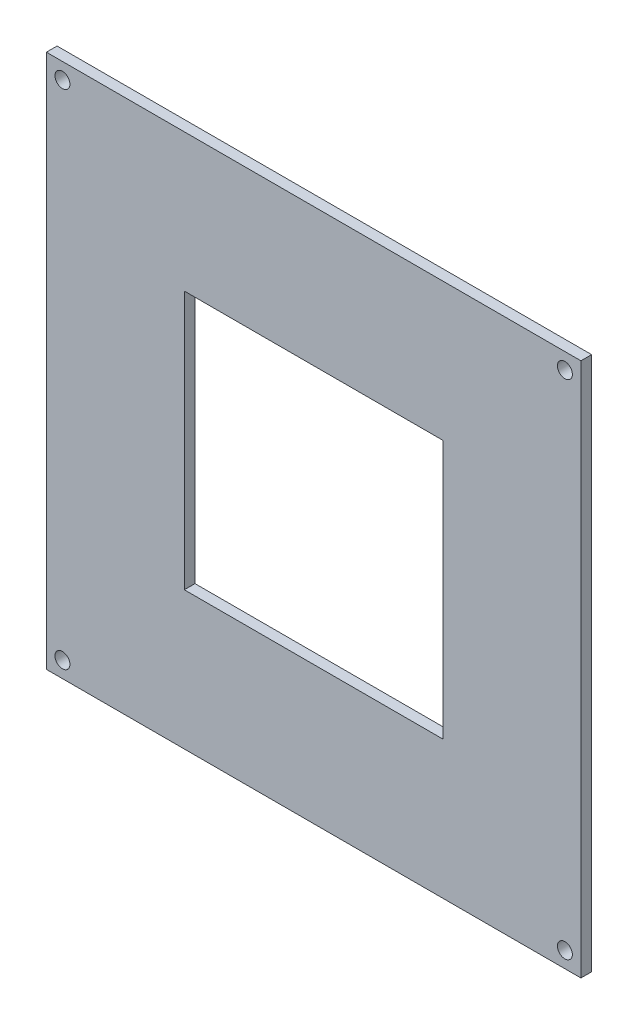
ISO-10303-21;
HEADER;
FILE_DESCRIPTION(('STEP AP214'),'2;1');
FILE_NAME('part.step','',(''),(''),'','','');
FILE_SCHEMA(('AUTOMOTIVE_DESIGN { 1 0 10303 214 1 1 1 1 }'));
ENDSEC;
DATA;
#1=APPLICATION_CONTEXT('core data for automotive mechanical design processes');
#2=APPLICATION_PROTOCOL_DEFINITION('international standard','automotive_design',2000,#1);
#3=PRODUCT_CONTEXT('',#1,'mechanical');
#4=PRODUCT('Part','Part','',(#3));
#5=PRODUCT_RELATED_PRODUCT_CATEGORY('part','',(#4));
#6=PRODUCT_DEFINITION_FORMATION('','',#4);
#7=PRODUCT_DEFINITION_CONTEXT('part definition',#1,'design');
#8=PRODUCT_DEFINITION('design','',#6,#7);
#9=PRODUCT_DEFINITION_SHAPE('','',#8);
#10=(LENGTH_UNIT() NAMED_UNIT(*) SI_UNIT(.MILLI.,.METRE.));
#11=(NAMED_UNIT(*) PLANE_ANGLE_UNIT() SI_UNIT($,.RADIAN.));
#12=(NAMED_UNIT(*) SI_UNIT($,.STERADIAN.) SOLID_ANGLE_UNIT());
#13=UNCERTAINTY_MEASURE_WITH_UNIT(LENGTH_MEASURE(1.E-05),#10,'distance_accuracy_value','');
#14=(GEOMETRIC_REPRESENTATION_CONTEXT(3) GLOBAL_UNCERTAINTY_ASSIGNED_CONTEXT((#13)) GLOBAL_UNIT_ASSIGNED_CONTEXT((#10,
#11,#12)) REPRESENTATION_CONTEXT('',''));
#15=CARTESIAN_POINT('',(0.,0.,0.));
#16=DIRECTION('',(0.,0.,1.));
#17=DIRECTION('',(1.,0.,0.));
#18=AXIS2_PLACEMENT_3D('',#15,#16,#17);
#19=CARTESIAN_POINT('',(-125.,125.,5.));
#20=DIRECTION('',(1.,0.,0.));
#21=DIRECTION('',(0.,1.,0.));
#22=AXIS2_PLACEMENT_3D('',#19,#20,#21);
#23=PLANE('',#22);
#24=DIRECTION('',(0.,-1.,0.));
#25=VECTOR('',#24,1.);
#26=CARTESIAN_POINT('',(-125.,125.,0.));
#27=LINE('',#26,#25);
#28=CARTESIAN_POINT('',(-125.,125.,0.));
#29=VERTEX_POINT('',#28);
#30=CARTESIAN_POINT('',(-125.,-125.,0.));
#31=VERTEX_POINT('',#30);
#32=EDGE_CURVE('E180',#29,#31,#27,.T.);
#33=ORIENTED_EDGE('',*,*,#32,.T.);
#34=DIRECTION('',(0.,0.,-1.));
#35=VECTOR('',#34,1.);
#36=CARTESIAN_POINT('',(-125.,-125.,5.));
#37=LINE('',#36,#35);
#38=CARTESIAN_POINT('',(-125.,-125.,5.));
#39=VERTEX_POINT('',#38);
#40=EDGE_CURVE('E11',#39,#31,#37,.T.);
#41=ORIENTED_EDGE('',*,*,#40,.F.);
#42=DIRECTION('',(0.,-1.,0.));
#43=VECTOR('',#42,1.);
#44=CARTESIAN_POINT('',(-125.,125.,5.));
#45=LINE('',#44,#43);
#46=CARTESIAN_POINT('',(-125.,125.,5.));
#47=VERTEX_POINT('',#46);
#48=EDGE_CURVE('E184',#47,#39,#45,.T.);
#49=ORIENTED_EDGE('',*,*,#48,.F.);
#50=DIRECTION('',(0.,0.,-1.));
#51=VECTOR('',#50,1.);
#52=CARTESIAN_POINT('',(-125.,125.,5.));
#53=LINE('',#52,#51);
#54=EDGE_CURVE('E198',#47,#29,#53,.T.);
#55=ORIENTED_EDGE('',*,*,#54,.T.);
#56=EDGE_LOOP('',(#33,#41,#49,#55));
#57=FACE_BOUND('',#56,.T.);
#58=ADVANCED_FACE('F38',(#57),#23,.F.);
#59=CARTESIAN_POINT('',(-125.,-125.,5.));
#60=DIRECTION('',(0.,1.,0.));
#61=DIRECTION('',(0.,0.,1.));
#62=AXIS2_PLACEMENT_3D('',#59,#60,#61);
#63=PLANE('',#62);
#64=DIRECTION('',(1.,0.,0.));
#65=VECTOR('',#64,1.);
#66=CARTESIAN_POINT('',(-125.,-125.,0.));
#67=LINE('',#66,#65);
#68=CARTESIAN_POINT('',(125.,-125.,0.));
#69=VERTEX_POINT('',#68);
#70=EDGE_CURVE('E202',#31,#69,#67,.T.);
#71=ORIENTED_EDGE('',*,*,#70,.T.);
#72=DIRECTION('',(0.,0.,-1.));
#73=VECTOR('',#72,1.);
#74=CARTESIAN_POINT('',(125.,-125.,5.));
#75=LINE('',#74,#73);
#76=CARTESIAN_POINT('',(125.,-125.,5.));
#77=VERTEX_POINT('',#76);
#78=EDGE_CURVE('E46',#77,#69,#75,.T.);
#79=ORIENTED_EDGE('',*,*,#78,.F.);
#80=DIRECTION('',(1.,0.,0.));
#81=VECTOR('',#80,1.);
#82=CARTESIAN_POINT('',(-125.,-125.,5.));
#83=LINE('',#82,#81);
#84=EDGE_CURVE('E188',#39,#77,#83,.T.);
#85=ORIENTED_EDGE('',*,*,#84,.F.);
#86=ORIENTED_EDGE('',*,*,#40,.T.);
#87=EDGE_LOOP('',(#71,#79,#85,#86));
#88=FACE_BOUND('',#87,.T.);
#89=ADVANCED_FACE('F237',(#88),#63,.F.);
#90=CARTESIAN_POINT('',(125.,125.,5.));
#91=DIRECTION('',(-1.,0.,0.));
#92=DIRECTION('',(0.,-1.,0.));
#93=AXIS2_PLACEMENT_3D('',#90,#91,#92);
#94=PLANE('',#93);
#95=DIRECTION('',(0.,1.,0.));
#96=VECTOR('',#95,1.);
#97=CARTESIAN_POINT('',(125.,125.,0.));
#98=LINE('',#97,#96);
#99=CARTESIAN_POINT('',(125.,125.,0.));
#100=VERTEX_POINT('',#99);
#101=EDGE_CURVE('E205',#69,#100,#98,.T.);
#102=ORIENTED_EDGE('',*,*,#101,.T.);
#103=DIRECTION('',(0.,0.,-1.));
#104=VECTOR('',#103,1.);
#105=CARTESIAN_POINT('',(125.,125.,5.));
#106=LINE('',#105,#104);
#107=CARTESIAN_POINT('',(125.,125.,5.));
#108=VERTEX_POINT('',#107);
#109=EDGE_CURVE('E213',#108,#100,#106,.T.);
#110=ORIENTED_EDGE('',*,*,#109,.F.);
#111=DIRECTION('',(0.,1.,0.));
#112=VECTOR('',#111,1.);
#113=CARTESIAN_POINT('',(125.,125.,5.));
#114=LINE('',#113,#112);
#115=EDGE_CURVE('E192',#77,#108,#114,.T.);
#116=ORIENTED_EDGE('',*,*,#115,.F.);
#117=ORIENTED_EDGE('',*,*,#78,.T.);
#118=EDGE_LOOP('',(#102,#110,#116,#117));
#119=FACE_BOUND('',#118,.T.);
#120=ADVANCED_FACE('F222',(#119),#94,.F.);
#121=CARTESIAN_POINT('',(-125.,125.,5.));
#122=DIRECTION('',(0.,-1.,0.));
#123=DIRECTION('',(0.,0.,-1.));
#124=AXIS2_PLACEMENT_3D('',#121,#122,#123);
#125=PLANE('',#124);
#126=DIRECTION('',(-1.,0.,0.));
#127=VECTOR('',#126,1.);
#128=CARTESIAN_POINT('',(-125.,125.,0.));
#129=LINE('',#128,#127);
#130=EDGE_CURVE('E189',#100,#29,#129,.T.);
#131=ORIENTED_EDGE('',*,*,#130,.T.);
#132=ORIENTED_EDGE('',*,*,#54,.F.);
#133=DIRECTION('',(-1.,0.,0.));
#134=VECTOR('',#133,1.);
#135=CARTESIAN_POINT('',(-125.,125.,5.));
#136=LINE('',#135,#134);
#137=EDGE_CURVE('E195',#108,#47,#136,.T.);
#138=ORIENTED_EDGE('',*,*,#137,.F.);
#139=ORIENTED_EDGE('',*,*,#109,.T.);
#140=EDGE_LOOP('',(#131,#132,#138,#139));
#141=FACE_BOUND('',#140,.T.);
#142=ADVANCED_FACE('F230',(#141),#125,.F.);
#143=CARTESIAN_POINT('',(0.,0.,5.));
#144=DIRECTION('',(0.,0.,1.));
#145=DIRECTION('',(1.,0.,0.));
#146=AXIS2_PLACEMENT_3D('',#143,#144,#145);
#147=PLANE('',#146);
#148=DIRECTION('',(0.,-1.,0.));
#149=VECTOR('',#148,1.);
#150=CARTESIAN_POINT('',(-60.5,60.5,5.));
#151=LINE('',#150,#149);
#152=CARTESIAN_POINT('',(-60.5,60.5,5.));
#153=VERTEX_POINT('',#152);
#154=CARTESIAN_POINT('',(-60.5,-60.5,5.));
#155=VERTEX_POINT('',#154);
#156=EDGE_CURVE('E53',#153,#155,#151,.T.);
#157=ORIENTED_EDGE('',*,*,#156,.F.);
#158=DIRECTION('',(-1.,0.,0.));
#159=VECTOR('',#158,1.);
#160=CARTESIAN_POINT('',(-60.5,60.5,5.));
#161=LINE('',#160,#159);
#162=CARTESIAN_POINT('',(60.5,60.5,5.));
#163=VERTEX_POINT('',#162);
#164=EDGE_CURVE('E124',#163,#153,#161,.T.);
#165=ORIENTED_EDGE('',*,*,#164,.F.);
#166=DIRECTION('',(0.,1.,0.));
#167=VECTOR('',#166,1.);
#168=CARTESIAN_POINT('',(60.5,60.5,5.));
#169=LINE('',#168,#167);
#170=CARTESIAN_POINT('',(60.5,-60.5,5.));
#171=VERTEX_POINT('',#170);
#172=EDGE_CURVE('E128',#171,#163,#169,.T.);
#173=ORIENTED_EDGE('',*,*,#172,.F.);
#174=DIRECTION('',(1.,0.,0.));
#175=VECTOR('',#174,1.);
#176=CARTESIAN_POINT('',(-60.5,-60.5,5.));
#177=LINE('',#176,#175);
#178=EDGE_CURVE('E137',#155,#171,#177,.T.);
#179=ORIENTED_EDGE('',*,*,#178,.F.);
#180=EDGE_LOOP('',(#157,#165,#173,#179));
#181=FACE_BOUND('',#180,.T.);
#182=CARTESIAN_POINT('',(117.5,117.5,5.));
#183=DIRECTION('',(0.,0.,1.));
#184=DIRECTION('',(-1.,0.,0.));
#185=AXIS2_PLACEMENT_3D('',#182,#183,#184);
#186=CIRCLE('',#185,3.49999999999999);
#187=CARTESIAN_POINT('',(114.,117.5,5.));
#188=VERTEX_POINT('',#187);
#189=EDGE_CURVE('E165',#188,#188,#186,.T.);
#190=ORIENTED_EDGE('',*,*,#189,.F.);
#191=EDGE_LOOP('',(#190));
#192=FACE_BOUND('',#191,.T.);
#193=CARTESIAN_POINT('',(-117.5,-117.5,5.));
#194=DIRECTION('',(0.,0.,1.));
#195=DIRECTION('',(-1.,0.,0.));
#196=AXIS2_PLACEMENT_3D('',#193,#194,#195);
#197=CIRCLE('',#196,3.49999999999999);
#198=CARTESIAN_POINT('',(-121.,-117.5,5.));
#199=VERTEX_POINT('',#198);
#200=EDGE_CURVE('E156',#199,#199,#197,.T.);
#201=ORIENTED_EDGE('',*,*,#200,.F.);
#202=EDGE_LOOP('',(#201));
#203=FACE_BOUND('',#202,.T.);
#204=CARTESIAN_POINT('',(117.5,-117.5,5.));
#205=DIRECTION('',(0.,0.,1.));
#206=DIRECTION('',(1.,0.,0.));
#207=AXIS2_PLACEMENT_3D('',#204,#205,#206);
#208=CIRCLE('',#207,3.49999999999999);
#209=CARTESIAN_POINT('',(121.,-117.5,5.));
#210=VERTEX_POINT('',#209);
#211=EDGE_CURVE('E146',#210,#210,#208,.T.);
#212=ORIENTED_EDGE('',*,*,#211,.F.);
#213=EDGE_LOOP('',(#212));
#214=FACE_BOUND('',#213,.T.);
#215=CARTESIAN_POINT('',(-117.5,117.5,5.));
#216=DIRECTION('',(0.,0.,1.));
#217=DIRECTION('',(1.,0.,0.));
#218=AXIS2_PLACEMENT_3D('',#215,#216,#217);
#219=CIRCLE('',#218,3.49999999999999);
#220=CARTESIAN_POINT('',(-114.,117.5,5.));
#221=VERTEX_POINT('',#220);
#222=EDGE_CURVE('E164',#221,#221,#219,.T.);
#223=ORIENTED_EDGE('',*,*,#222,.F.);
#224=EDGE_LOOP('',(#223));
#225=FACE_BOUND('',#224,.T.);
#226=ORIENTED_EDGE('',*,*,#48,.T.);
#227=ORIENTED_EDGE('',*,*,#84,.T.);
#228=ORIENTED_EDGE('',*,*,#115,.T.);
#229=ORIENTED_EDGE('',*,*,#137,.T.);
#230=EDGE_LOOP('',(#226,#227,#228,#229));
#231=FACE_BOUND('',#230,.T.);
#232=ADVANCED_FACE('F236',(#181,#192,#203,#214,#225,#231),#147,.T.);
#233=CARTESIAN_POINT('',(0.,0.,0.));
#234=DIRECTION('',(0.,0.,1.));
#235=DIRECTION('',(1.,0.,0.));
#236=AXIS2_PLACEMENT_3D('',#233,#234,#235);
#237=PLANE('',#236);
#238=DIRECTION('',(-1.,0.,0.));
#239=VECTOR('',#238,1.);
#240=CARTESIAN_POINT('',(-60.5,60.5,0.));
#241=LINE('',#240,#239);
#242=CARTESIAN_POINT('',(60.5,60.5,0.));
#243=VERTEX_POINT('',#242);
#244=CARTESIAN_POINT('',(-60.5,60.5,0.));
#245=VERTEX_POINT('',#244);
#246=EDGE_CURVE('E112',#243,#245,#241,.T.);
#247=ORIENTED_EDGE('',*,*,#246,.T.);
#248=DIRECTION('',(0.,-1.,0.));
#249=VECTOR('',#248,1.);
#250=CARTESIAN_POINT('',(-60.5,60.5,0.));
#251=LINE('',#250,#249);
#252=CARTESIAN_POINT('',(-60.5,-60.5,0.));
#253=VERTEX_POINT('',#252);
#254=EDGE_CURVE('E105',#245,#253,#251,.T.);
#255=ORIENTED_EDGE('',*,*,#254,.T.);
#256=DIRECTION('',(1.,0.,0.));
#257=VECTOR('',#256,1.);
#258=CARTESIAN_POINT('',(-60.5,-60.5,0.));
#259=LINE('',#258,#257);
#260=CARTESIAN_POINT('',(60.5,-60.5,0.));
#261=VERTEX_POINT('',#260);
#262=EDGE_CURVE('E115',#253,#261,#259,.T.);
#263=ORIENTED_EDGE('',*,*,#262,.T.);
#264=DIRECTION('',(0.,1.,0.));
#265=VECTOR('',#264,1.);
#266=CARTESIAN_POINT('',(60.5,60.5,0.));
#267=LINE('',#266,#265);
#268=EDGE_CURVE('E61',#261,#243,#267,.T.);
#269=ORIENTED_EDGE('',*,*,#268,.T.);
#270=EDGE_LOOP('',(#247,#255,#263,#269));
#271=FACE_BOUND('',#270,.T.);
#272=CARTESIAN_POINT('',(117.5,117.5,0.));
#273=DIRECTION('',(0.,0.,1.));
#274=DIRECTION('',(-1.,0.,0.));
#275=AXIS2_PLACEMENT_3D('',#272,#273,#274);
#276=CIRCLE('',#275,3.49999999999999);
#277=CARTESIAN_POINT('',(114.,117.5,0.));
#278=VERTEX_POINT('',#277);
#279=EDGE_CURVE('E160',#278,#278,#276,.T.);
#280=ORIENTED_EDGE('',*,*,#279,.T.);
#281=EDGE_LOOP('',(#280));
#282=FACE_BOUND('',#281,.T.);
#283=CARTESIAN_POINT('',(-117.5,-117.5,0.));
#284=DIRECTION('',(0.,0.,1.));
#285=DIRECTION('',(-1.,0.,0.));
#286=AXIS2_PLACEMENT_3D('',#283,#284,#285);
#287=CIRCLE('',#286,3.49999999999999);
#288=CARTESIAN_POINT('',(-121.,-117.5,0.));
#289=VERTEX_POINT('',#288);
#290=EDGE_CURVE('E169',#289,#289,#287,.T.);
#291=ORIENTED_EDGE('',*,*,#290,.T.);
#292=EDGE_LOOP('',(#291));
#293=FACE_BOUND('',#292,.T.);
#294=CARTESIAN_POINT('',(117.5,-117.5,0.));
#295=DIRECTION('',(0.,0.,1.));
#296=DIRECTION('',(1.,0.,0.));
#297=AXIS2_PLACEMENT_3D('',#294,#295,#296);
#298=CIRCLE('',#297,3.49999999999999);
#299=CARTESIAN_POINT('',(121.,-117.5,0.));
#300=VERTEX_POINT('',#299);
#301=EDGE_CURVE('E152',#300,#300,#298,.T.);
#302=ORIENTED_EDGE('',*,*,#301,.T.);
#303=EDGE_LOOP('',(#302));
#304=FACE_BOUND('',#303,.T.);
#305=CARTESIAN_POINT('',(-117.5,117.5,0.));
#306=DIRECTION('',(0.,0.,1.));
#307=DIRECTION('',(1.,0.,0.));
#308=AXIS2_PLACEMENT_3D('',#305,#306,#307);
#309=CIRCLE('',#308,3.49999999999999);
#310=CARTESIAN_POINT('',(-114.,117.5,0.));
#311=VERTEX_POINT('',#310);
#312=EDGE_CURVE('E176',#311,#311,#309,.T.);
#313=ORIENTED_EDGE('',*,*,#312,.T.);
#314=EDGE_LOOP('',(#313));
#315=FACE_BOUND('',#314,.T.);
#316=ORIENTED_EDGE('',*,*,#32,.F.);
#317=ORIENTED_EDGE('',*,*,#130,.F.);
#318=ORIENTED_EDGE('',*,*,#101,.F.);
#319=ORIENTED_EDGE('',*,*,#70,.F.);
#320=EDGE_LOOP('',(#316,#317,#318,#319));
#321=FACE_BOUND('',#320,.T.);
#322=ADVANCED_FACE('F120',(#271,#282,#293,#304,#315,#321),#237,.F.);
#323=CARTESIAN_POINT('',(-117.5,117.5,0.));
#324=DIRECTION('',(0.,0.,1.));
#325=DIRECTION('',(1.,0.,0.));
#326=AXIS2_PLACEMENT_3D('',#323,#324,#325);
#327=CYLINDRICAL_SURFACE('',#326,3.49999999999999);
#328=ORIENTED_EDGE('',*,*,#312,.F.);
#329=EDGE_LOOP('',(#328));
#330=FACE_BOUND('',#329,.T.);
#331=ORIENTED_EDGE('',*,*,#222,.T.);
#332=EDGE_LOOP('',(#331));
#333=FACE_BOUND('',#332,.T.);
#334=ADVANCED_FACE('F249',(#330,#333),#327,.F.);
#335=CARTESIAN_POINT('',(117.5,-117.5,0.));
#336=DIRECTION('',(0.,0.,1.));
#337=DIRECTION('',(1.,0.,0.));
#338=AXIS2_PLACEMENT_3D('',#335,#336,#337);
#339=CYLINDRICAL_SURFACE('',#338,3.49999999999999);
#340=ORIENTED_EDGE('',*,*,#301,.F.);
#341=EDGE_LOOP('',(#340));
#342=FACE_BOUND('',#341,.T.);
#343=ORIENTED_EDGE('',*,*,#211,.T.);
#344=EDGE_LOOP('',(#343));
#345=FACE_BOUND('',#344,.T.);
#346=ADVANCED_FACE('F255',(#342,#345),#339,.F.);
#347=CARTESIAN_POINT('',(-117.5,-117.5,0.));
#348=DIRECTION('',(0.,0.,1.));
#349=DIRECTION('',(1.,0.,0.));
#350=AXIS2_PLACEMENT_3D('',#347,#348,#349);
#351=CYLINDRICAL_SURFACE('',#350,3.49999999999999);
#352=ORIENTED_EDGE('',*,*,#290,.F.);
#353=EDGE_LOOP('',(#352));
#354=FACE_BOUND('',#353,.T.);
#355=ORIENTED_EDGE('',*,*,#200,.T.);
#356=EDGE_LOOP('',(#355));
#357=FACE_BOUND('',#356,.T.);
#358=ADVANCED_FACE('F257',(#354,#357),#351,.F.);
#359=CARTESIAN_POINT('',(117.5,117.5,0.));
#360=DIRECTION('',(0.,0.,1.));
#361=DIRECTION('',(1.,0.,0.));
#362=AXIS2_PLACEMENT_3D('',#359,#360,#361);
#363=CYLINDRICAL_SURFACE('',#362,3.49999999999999);
#364=ORIENTED_EDGE('',*,*,#279,.F.);
#365=EDGE_LOOP('',(#364));
#366=FACE_BOUND('',#365,.T.);
#367=ORIENTED_EDGE('',*,*,#189,.T.);
#368=EDGE_LOOP('',(#367));
#369=FACE_BOUND('',#368,.T.);
#370=ADVANCED_FACE('F260',(#366,#369),#363,.F.);
#371=CARTESIAN_POINT('',(-60.5,60.5,0.));
#372=DIRECTION('',(-1.,0.,0.));
#373=DIRECTION('',(0.,-1.,0.));
#374=AXIS2_PLACEMENT_3D('',#371,#372,#373);
#375=PLANE('',#374);
#376=ORIENTED_EDGE('',*,*,#156,.T.);
#377=DIRECTION('',(0.,0.,1.));
#378=VECTOR('',#377,1.);
#379=CARTESIAN_POINT('',(-60.5,-60.5,0.));
#380=LINE('',#379,#378);
#381=EDGE_CURVE('E101',#253,#155,#380,.T.);
#382=ORIENTED_EDGE('',*,*,#381,.F.);
#383=ORIENTED_EDGE('',*,*,#254,.F.);
#384=DIRECTION('',(0.,0.,1.));
#385=VECTOR('',#384,1.);
#386=CARTESIAN_POINT('',(-60.5,60.5,0.));
#387=LINE('',#386,#385);
#388=EDGE_CURVE('E143',#245,#153,#387,.T.);
#389=ORIENTED_EDGE('',*,*,#388,.T.);
#390=EDGE_LOOP('',(#376,#382,#383,#389));
#391=FACE_BOUND('',#390,.T.);
#392=ADVANCED_FACE('F103',(#391),#375,.F.);
#393=CARTESIAN_POINT('',(-60.5,60.5,0.));
#394=DIRECTION('',(0.,1.,0.));
#395=DIRECTION('',(0.,0.,1.));
#396=AXIS2_PLACEMENT_3D('',#393,#394,#395);
#397=PLANE('',#396);
#398=ORIENTED_EDGE('',*,*,#164,.T.);
#399=ORIENTED_EDGE('',*,*,#388,.F.);
#400=ORIENTED_EDGE('',*,*,#246,.F.);
#401=DIRECTION('',(0.,0.,1.));
#402=VECTOR('',#401,1.);
#403=CARTESIAN_POINT('',(60.5,60.5,0.));
#404=LINE('',#403,#402);
#405=EDGE_CURVE('E147',#243,#163,#404,.T.);
#406=ORIENTED_EDGE('',*,*,#405,.T.);
#407=EDGE_LOOP('',(#398,#399,#400,#406));
#408=FACE_BOUND('',#407,.T.);
#409=ADVANCED_FACE('F270',(#408),#397,.F.);
#410=CARTESIAN_POINT('',(60.5,60.5,0.));
#411=DIRECTION('',(1.,0.,0.));
#412=DIRECTION('',(0.,0.,-1.));
#413=AXIS2_PLACEMENT_3D('',#410,#411,#412);
#414=PLANE('',#413);
#415=ORIENTED_EDGE('',*,*,#172,.T.);
#416=ORIENTED_EDGE('',*,*,#405,.F.);
#417=ORIENTED_EDGE('',*,*,#268,.F.);
#418=DIRECTION('',(0.,0.,1.));
#419=VECTOR('',#418,1.);
#420=CARTESIAN_POINT('',(60.5,-60.5,0.));
#421=LINE('',#420,#419);
#422=EDGE_CURVE('E111',#261,#171,#421,.T.);
#423=ORIENTED_EDGE('',*,*,#422,.T.);
#424=EDGE_LOOP('',(#415,#416,#417,#423));
#425=FACE_BOUND('',#424,.T.);
#426=ADVANCED_FACE('F273',(#425),#414,.F.);
#427=CARTESIAN_POINT('',(-60.5,-60.5,0.));
#428=DIRECTION('',(0.,-1.,0.));
#429=DIRECTION('',(0.,0.,-1.));
#430=AXIS2_PLACEMENT_3D('',#427,#428,#429);
#431=PLANE('',#430);
#432=ORIENTED_EDGE('',*,*,#178,.T.);
#433=ORIENTED_EDGE('',*,*,#422,.F.);
#434=ORIENTED_EDGE('',*,*,#262,.F.);
#435=ORIENTED_EDGE('',*,*,#381,.T.);
#436=EDGE_LOOP('',(#432,#433,#434,#435));
#437=FACE_BOUND('',#436,.T.);
#438=ADVANCED_FACE('F116',(#437),#431,.F.);
#439=CLOSED_SHELL('',(#58,#89,#120,#142,#232,#322,#334,#346,#358,#370,#392,#409,#426,#438));
#440=MANIFOLD_SOLID_BREP('B2',#439);
#441=ADVANCED_BREP_SHAPE_REPRESENTATION('',(#18,#440),#14);
#442=SHAPE_DEFINITION_REPRESENTATION(#9,#441);
ENDSEC;
END-ISO-10303-21;
